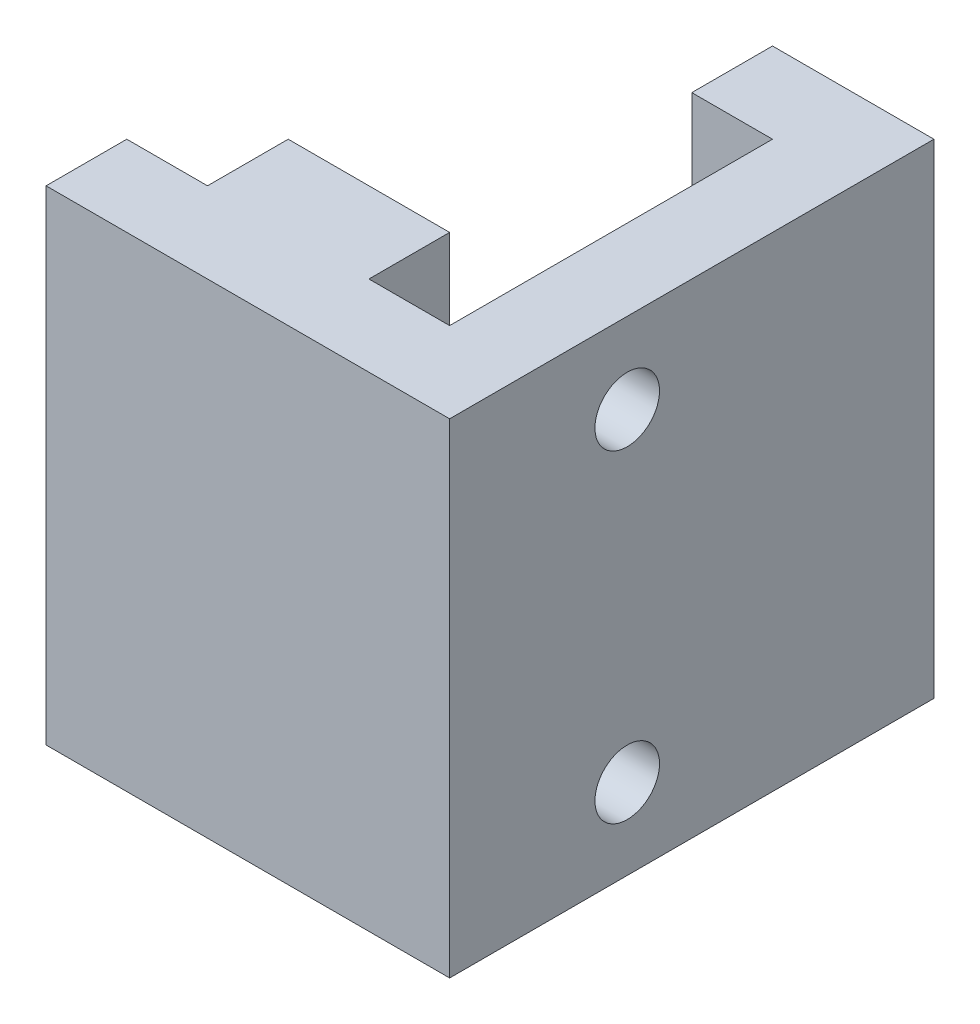
ISO-10303-21;
HEADER;
FILE_DESCRIPTION(('STEP AP214'),'2;1');
FILE_NAME('part.step','',(''),(''),'','','');
FILE_SCHEMA(('AUTOMOTIVE_DESIGN { 1 0 10303 214 1 1 1 1 }'));
ENDSEC;
DATA;
#1=APPLICATION_CONTEXT('core data for automotive mechanical design processes');
#2=APPLICATION_PROTOCOL_DEFINITION('international standard','automotive_design',2000,#1);
#3=PRODUCT_CONTEXT('',#1,'mechanical');
#4=PRODUCT('Part','Part','',(#3));
#5=PRODUCT_RELATED_PRODUCT_CATEGORY('part','',(#4));
#6=PRODUCT_DEFINITION_FORMATION('','',#4);
#7=PRODUCT_DEFINITION_CONTEXT('part definition',#1,'design');
#8=PRODUCT_DEFINITION('design','',#6,#7);
#9=PRODUCT_DEFINITION_SHAPE('','',#8);
#10=(LENGTH_UNIT() NAMED_UNIT(*) SI_UNIT(.MILLI.,.METRE.));
#11=(NAMED_UNIT(*) PLANE_ANGLE_UNIT() SI_UNIT($,.RADIAN.));
#12=(NAMED_UNIT(*) SI_UNIT($,.STERADIAN.) SOLID_ANGLE_UNIT());
#13=UNCERTAINTY_MEASURE_WITH_UNIT(LENGTH_MEASURE(1.E-05),#10,'distance_accuracy_value','');
#14=(GEOMETRIC_REPRESENTATION_CONTEXT(3) GLOBAL_UNCERTAINTY_ASSIGNED_CONTEXT((#13)) GLOBAL_UNIT_ASSIGNED_CONTEXT((#10,
#11,#12)) REPRESENTATION_CONTEXT('',''));
#15=CARTESIAN_POINT('',(0.,0.,0.));
#16=DIRECTION('',(0.,0.,1.));
#17=DIRECTION('',(1.,0.,0.));
#18=AXIS2_PLACEMENT_3D('',#15,#16,#17);
#19=CARTESIAN_POINT('',(5.,30.,-5.));
#20=DIRECTION('',(0.,0.,1.));
#21=DIRECTION('',(1.,0.,0.));
#22=AXIS2_PLACEMENT_3D('',#19,#20,#21);
#23=PLANE('',#22);
#24=DIRECTION('',(-1.,0.,0.));
#25=VECTOR('',#24,1.);
#26=CARTESIAN_POINT('',(5.,0.,-5.));
#27=LINE('',#26,#25);
#28=CARTESIAN_POINT('',(5.,0.,-5.));
#29=VERTEX_POINT('',#28);
#30=CARTESIAN_POINT('',(0.,0.,-5.));
#31=VERTEX_POINT('',#30);
#32=EDGE_CURVE('E159',#29,#31,#27,.T.);
#33=ORIENTED_EDGE('',*,*,#32,.T.);
#34=DIRECTION('',(0.,-1.,0.));
#35=VECTOR('',#34,1.);
#36=CARTESIAN_POINT('',(0.,30.,-5.));
#37=LINE('',#36,#35);
#38=CARTESIAN_POINT('',(0.,30.,-5.));
#39=VERTEX_POINT('',#38);
#40=EDGE_CURVE('E11',#39,#31,#37,.T.);
#41=ORIENTED_EDGE('',*,*,#40,.F.);
#42=DIRECTION('',(-1.,0.,0.));
#43=VECTOR('',#42,1.);
#44=CARTESIAN_POINT('',(5.,30.,-5.));
#45=LINE('',#44,#43);
#46=CARTESIAN_POINT('',(5.,30.,-5.));
#47=VERTEX_POINT('',#46);
#48=EDGE_CURVE('E182',#47,#39,#45,.T.);
#49=ORIENTED_EDGE('',*,*,#48,.F.);
#50=DIRECTION('',(0.,-1.,0.));
#51=VECTOR('',#50,1.);
#52=CARTESIAN_POINT('',(5.,30.,-5.));
#53=LINE('',#52,#51);
#54=EDGE_CURVE('E155',#47,#29,#53,.T.);
#55=ORIENTED_EDGE('',*,*,#54,.T.);
#56=EDGE_LOOP('',(#33,#41,#49,#55));
#57=FACE_BOUND('',#56,.T.);
#58=ADVANCED_FACE('F39',(#57),#23,.F.);
#59=CARTESIAN_POINT('',(0.,30.,-5.));
#60=DIRECTION('',(1.,0.,0.));
#61=DIRECTION('',(0.,0.,-1.));
#62=AXIS2_PLACEMENT_3D('',#59,#60,#61);
#63=PLANE('',#62);
#64=DIRECTION('',(0.,0.,1.));
#65=VECTOR('',#64,1.);
#66=CARTESIAN_POINT('',(0.,0.,-5.));
#67=LINE('',#66,#65);
#68=CARTESIAN_POINT('',(0.,0.,0.));
#69=VERTEX_POINT('',#68);
#70=EDGE_CURVE('E162',#31,#69,#67,.T.);
#71=ORIENTED_EDGE('',*,*,#70,.T.);
#72=DIRECTION('',(0.,-1.,0.));
#73=VECTOR('',#72,1.);
#74=CARTESIAN_POINT('',(0.,30.,0.));
#75=LINE('',#74,#73);
#76=CARTESIAN_POINT('',(0.,30.,0.));
#77=VERTEX_POINT('',#76);
#78=EDGE_CURVE('E47',#77,#69,#75,.T.);
#79=ORIENTED_EDGE('',*,*,#78,.F.);
#80=DIRECTION('',(0.,0.,1.));
#81=VECTOR('',#80,1.);
#82=CARTESIAN_POINT('',(0.,30.,-5.));
#83=LINE('',#82,#81);
#84=EDGE_CURVE('E110',#39,#77,#83,.T.);
#85=ORIENTED_EDGE('',*,*,#84,.F.);
#86=ORIENTED_EDGE('',*,*,#40,.T.);
#87=EDGE_LOOP('',(#71,#79,#85,#86));
#88=FACE_BOUND('',#87,.T.);
#89=ADVANCED_FACE('F260',(#88),#63,.F.);
#90=CARTESIAN_POINT('',(0.,30.,0.));
#91=DIRECTION('',(0.,0.,-1.));
#92=DIRECTION('',(-1.,0.,0.));
#93=AXIS2_PLACEMENT_3D('',#90,#91,#92);
#94=PLANE('',#93);
#95=DIRECTION('',(1.,0.,0.));
#96=VECTOR('',#95,1.);
#97=CARTESIAN_POINT('',(0.,0.,0.));
#98=LINE('',#97,#96);
#99=CARTESIAN_POINT('',(25.,0.,0.));
#100=VERTEX_POINT('',#99);
#101=EDGE_CURVE('E165',#69,#100,#98,.T.);
#102=ORIENTED_EDGE('',*,*,#101,.T.);
#103=DIRECTION('',(0.,-1.,0.));
#104=VECTOR('',#103,1.);
#105=CARTESIAN_POINT('',(25.,30.,0.));
#106=LINE('',#105,#104);
#107=CARTESIAN_POINT('',(25.,30.,0.));
#108=VERTEX_POINT('',#107);
#109=EDGE_CURVE('E201',#108,#100,#106,.T.);
#110=ORIENTED_EDGE('',*,*,#109,.F.);
#111=DIRECTION('',(1.,0.,0.));
#112=VECTOR('',#111,1.);
#113=CARTESIAN_POINT('',(0.,30.,0.));
#114=LINE('',#113,#112);
#115=EDGE_CURVE('E209',#77,#108,#114,.T.);
#116=ORIENTED_EDGE('',*,*,#115,.F.);
#117=ORIENTED_EDGE('',*,*,#78,.T.);
#118=EDGE_LOOP('',(#102,#110,#116,#117));
#119=FACE_BOUND('',#118,.T.);
#120=ADVANCED_FACE('F207',(#119),#94,.F.);
#121=CARTESIAN_POINT('',(25.,30.,0.));
#122=DIRECTION('',(-1.,0.,0.));
#123=DIRECTION('',(0.,0.,1.));
#124=AXIS2_PLACEMENT_3D('',#121,#122,#123);
#125=PLANE('',#124);
#126=CARTESIAN_POINT('',(25.,25.,-11.));
#127=DIRECTION('',(1.,0.,0.));
#128=DIRECTION('',(0.,0.,-1.));
#129=AXIS2_PLACEMENT_3D('',#126,#127,#128);
#130=CIRCLE('',#129,2.);
#131=CARTESIAN_POINT('',(25.,25.,-13.));
#132=VERTEX_POINT('',#131);
#133=EDGE_CURVE('E359',#132,#132,#130,.T.);
#134=ORIENTED_EDGE('',*,*,#133,.F.);
#135=EDGE_LOOP('',(#134));
#136=FACE_BOUND('',#135,.T.);
#137=CARTESIAN_POINT('',(25.,5.,-11.));
#138=DIRECTION('',(1.,0.,0.));
#139=DIRECTION('',(0.,0.,-1.));
#140=AXIS2_PLACEMENT_3D('',#137,#138,#139);
#141=CIRCLE('',#140,2.);
#142=CARTESIAN_POINT('',(25.,5.,-13.));
#143=VERTEX_POINT('',#142);
#144=EDGE_CURVE('E362',#143,#143,#141,.T.);
#145=ORIENTED_EDGE('',*,*,#144,.F.);
#146=EDGE_LOOP('',(#145));
#147=FACE_BOUND('',#146,.T.);
#148=DIRECTION('',(0.,0.,-1.));
#149=VECTOR('',#148,1.);
#150=CARTESIAN_POINT('',(25.,0.,0.));
#151=LINE('',#150,#149);
#152=CARTESIAN_POINT('',(25.,0.,-30.));
#153=VERTEX_POINT('',#152);
#154=EDGE_CURVE('E167',#100,#153,#151,.T.);
#155=ORIENTED_EDGE('',*,*,#154,.T.);
#156=DIRECTION('',(0.,-1.,0.));
#157=VECTOR('',#156,1.);
#158=CARTESIAN_POINT('',(25.,30.,-30.));
#159=LINE('',#158,#157);
#160=CARTESIAN_POINT('',(25.,30.,-30.));
#161=VERTEX_POINT('',#160);
#162=EDGE_CURVE('E198',#161,#153,#159,.T.);
#163=ORIENTED_EDGE('',*,*,#162,.F.);
#164=DIRECTION('',(0.,0.,-1.));
#165=VECTOR('',#164,1.);
#166=CARTESIAN_POINT('',(25.,30.,0.));
#167=LINE('',#166,#165);
#168=EDGE_CURVE('E227',#108,#161,#167,.T.);
#169=ORIENTED_EDGE('',*,*,#168,.F.);
#170=ORIENTED_EDGE('',*,*,#109,.T.);
#171=EDGE_LOOP('',(#155,#163,#169,#170));
#172=FACE_BOUND('',#171,.T.);
#173=ADVANCED_FACE('F218',(#136,#147,#172),#125,.F.);
#174=CARTESIAN_POINT('',(25.,30.,-30.));
#175=DIRECTION('',(0.,0.,1.));
#176=DIRECTION('',(1.,0.,0.));
#177=AXIS2_PLACEMENT_3D('',#174,#175,#176);
#178=PLANE('',#177);
#179=DIRECTION('',(-1.,0.,0.));
#180=VECTOR('',#179,1.);
#181=CARTESIAN_POINT('',(25.,0.,-30.));
#182=LINE('',#181,#180);
#183=CARTESIAN_POINT('',(15.,0.,-30.));
#184=VERTEX_POINT('',#183);
#185=EDGE_CURVE('E169',#153,#184,#182,.T.);
#186=ORIENTED_EDGE('',*,*,#185,.T.);
#187=DIRECTION('',(0.,-1.,0.));
#188=VECTOR('',#187,1.);
#189=CARTESIAN_POINT('',(15.,30.,-30.));
#190=LINE('',#189,#188);
#191=CARTESIAN_POINT('',(15.,30.,-30.));
#192=VERTEX_POINT('',#191);
#193=EDGE_CURVE('E195',#192,#184,#190,.T.);
#194=ORIENTED_EDGE('',*,*,#193,.F.);
#195=DIRECTION('',(-1.,0.,0.));
#196=VECTOR('',#195,1.);
#197=CARTESIAN_POINT('',(25.,30.,-30.));
#198=LINE('',#197,#196);
#199=EDGE_CURVE('E224',#161,#192,#198,.T.);
#200=ORIENTED_EDGE('',*,*,#199,.F.);
#201=ORIENTED_EDGE('',*,*,#162,.T.);
#202=EDGE_LOOP('',(#186,#194,#200,#201));
#203=FACE_BOUND('',#202,.T.);
#204=ADVANCED_FACE('F222',(#203),#178,.F.);
#205=CARTESIAN_POINT('',(15.,30.,-30.));
#206=DIRECTION('',(1.,0.,0.));
#207=DIRECTION('',(0.,0.,-1.));
#208=AXIS2_PLACEMENT_3D('',#205,#206,#207);
#209=PLANE('',#208);
#210=DIRECTION('',(0.,0.,1.));
#211=VECTOR('',#210,1.);
#212=CARTESIAN_POINT('',(15.,0.,-30.));
#213=LINE('',#212,#211);
#214=CARTESIAN_POINT('',(15.,0.,-25.));
#215=VERTEX_POINT('',#214);
#216=EDGE_CURVE('E171',#184,#215,#213,.T.);
#217=ORIENTED_EDGE('',*,*,#216,.T.);
#218=DIRECTION('',(0.,-1.,0.));
#219=VECTOR('',#218,1.);
#220=CARTESIAN_POINT('',(15.,30.,-25.));
#221=LINE('',#220,#219);
#222=CARTESIAN_POINT('',(15.,30.,-25.));
#223=VERTEX_POINT('',#222);
#224=EDGE_CURVE('E192',#223,#215,#221,.T.);
#225=ORIENTED_EDGE('',*,*,#224,.F.);
#226=DIRECTION('',(0.,0.,1.));
#227=VECTOR('',#226,1.);
#228=CARTESIAN_POINT('',(15.,30.,-30.));
#229=LINE('',#228,#227);
#230=EDGE_CURVE('E226',#192,#223,#229,.T.);
#231=ORIENTED_EDGE('',*,*,#230,.F.);
#232=ORIENTED_EDGE('',*,*,#193,.T.);
#233=EDGE_LOOP('',(#217,#225,#231,#232));
#234=FACE_BOUND('',#233,.T.);
#235=ADVANCED_FACE('F274',(#234),#209,.F.);
#236=CARTESIAN_POINT('',(15.,30.,-25.));
#237=DIRECTION('',(0.,0.,-1.));
#238=DIRECTION('',(-1.,0.,0.));
#239=AXIS2_PLACEMENT_3D('',#236,#237,#238);
#240=PLANE('',#239);
#241=DIRECTION('',(1.,0.,0.));
#242=VECTOR('',#241,1.);
#243=CARTESIAN_POINT('',(15.,0.,-25.));
#244=LINE('',#243,#242);
#245=CARTESIAN_POINT('',(20.,0.,-25.));
#246=VERTEX_POINT('',#245);
#247=EDGE_CURVE('E173',#215,#246,#244,.T.);
#248=ORIENTED_EDGE('',*,*,#247,.T.);
#249=DIRECTION('',(0.,-1.,0.));
#250=VECTOR('',#249,1.);
#251=CARTESIAN_POINT('',(20.,30.,-25.));
#252=LINE('',#251,#250);
#253=CARTESIAN_POINT('',(20.,30.,-25.));
#254=VERTEX_POINT('',#253);
#255=EDGE_CURVE('E189',#254,#246,#252,.T.);
#256=ORIENTED_EDGE('',*,*,#255,.F.);
#257=DIRECTION('',(1.,0.,0.));
#258=VECTOR('',#257,1.);
#259=CARTESIAN_POINT('',(15.,30.,-25.));
#260=LINE('',#259,#258);
#261=EDGE_CURVE('E229',#223,#254,#260,.T.);
#262=ORIENTED_EDGE('',*,*,#261,.F.);
#263=ORIENTED_EDGE('',*,*,#224,.T.);
#264=EDGE_LOOP('',(#248,#256,#262,#263));
#265=FACE_BOUND('',#264,.T.);
#266=ADVANCED_FACE('F277',(#265),#240,.F.);
#267=CARTESIAN_POINT('',(20.,30.,-25.));
#268=DIRECTION('',(1.,0.,0.));
#269=DIRECTION('',(0.,0.,-1.));
#270=AXIS2_PLACEMENT_3D('',#267,#268,#269);
#271=PLANE('',#270);
#272=DIRECTION('',(0.,0.,1.));
#273=VECTOR('',#272,1.);
#274=CARTESIAN_POINT('',(20.,0.,-25.));
#275=LINE('',#274,#273);
#276=CARTESIAN_POINT('',(20.,0.,-5.));
#277=VERTEX_POINT('',#276);
#278=EDGE_CURVE('E175',#246,#277,#275,.T.);
#279=ORIENTED_EDGE('',*,*,#278,.T.);
#280=DIRECTION('',(0.,-1.,0.));
#281=VECTOR('',#280,1.);
#282=CARTESIAN_POINT('',(20.,30.,-5.));
#283=LINE('',#282,#281);
#284=CARTESIAN_POINT('',(20.,30.,-5.));
#285=VERTEX_POINT('',#284);
#286=EDGE_CURVE('E186',#285,#277,#283,.T.);
#287=ORIENTED_EDGE('',*,*,#286,.F.);
#288=DIRECTION('',(0.,0.,1.));
#289=VECTOR('',#288,1.);
#290=CARTESIAN_POINT('',(20.,30.,-25.));
#291=LINE('',#290,#289);
#292=EDGE_CURVE('E235',#254,#285,#291,.T.);
#293=ORIENTED_EDGE('',*,*,#292,.F.);
#294=ORIENTED_EDGE('',*,*,#255,.T.);
#295=EDGE_LOOP('',(#279,#287,#293,#294));
#296=FACE_BOUND('',#295,.T.);
#297=ADVANCED_FACE('F241',(#296),#271,.F.);
#298=CARTESIAN_POINT('',(20.,30.,-5.));
#299=DIRECTION('',(0.,0.,1.));
#300=DIRECTION('',(1.,0.,0.));
#301=AXIS2_PLACEMENT_3D('',#298,#299,#300);
#302=PLANE('',#301);
#303=DIRECTION('',(-1.,0.,0.));
#304=VECTOR('',#303,1.);
#305=CARTESIAN_POINT('',(20.,0.,-5.));
#306=LINE('',#305,#304);
#307=CARTESIAN_POINT('',(15.,0.,-5.));
#308=VERTEX_POINT('',#307);
#309=EDGE_CURVE('E177',#277,#308,#306,.T.);
#310=ORIENTED_EDGE('',*,*,#309,.T.);
#311=DIRECTION('',(0.,-1.,0.));
#312=VECTOR('',#311,1.);
#313=CARTESIAN_POINT('',(15.,30.,-5.));
#314=LINE('',#313,#312);
#315=CARTESIAN_POINT('',(15.,30.,-5.));
#316=VERTEX_POINT('',#315);
#317=EDGE_CURVE('E150',#316,#308,#314,.T.);
#318=ORIENTED_EDGE('',*,*,#317,.F.);
#319=DIRECTION('',(-1.,0.,0.));
#320=VECTOR('',#319,1.);
#321=CARTESIAN_POINT('',(20.,30.,-5.));
#322=LINE('',#321,#320);
#323=EDGE_CURVE('E141',#285,#316,#322,.T.);
#324=ORIENTED_EDGE('',*,*,#323,.F.);
#325=ORIENTED_EDGE('',*,*,#286,.T.);
#326=EDGE_LOOP('',(#310,#318,#324,#325));
#327=FACE_BOUND('',#326,.T.);
#328=ADVANCED_FACE('F245',(#327),#302,.F.);
#329=CARTESIAN_POINT('',(15.,30.,-5.));
#330=DIRECTION('',(-1.,0.,0.));
#331=DIRECTION('',(0.,0.,1.));
#332=AXIS2_PLACEMENT_3D('',#329,#330,#331);
#333=PLANE('',#332);
#334=DIRECTION('',(0.,0.,-1.));
#335=VECTOR('',#334,1.);
#336=CARTESIAN_POINT('',(15.,0.,-5.));
#337=LINE('',#336,#335);
#338=CARTESIAN_POINT('',(15.,0.,-10.));
#339=VERTEX_POINT('',#338);
#340=EDGE_CURVE('E149',#308,#339,#337,.T.);
#341=ORIENTED_EDGE('',*,*,#340,.T.);
#342=DIRECTION('',(0.,-1.,0.));
#343=VECTOR('',#342,1.);
#344=CARTESIAN_POINT('',(15.,30.,-10.));
#345=LINE('',#344,#343);
#346=CARTESIAN_POINT('',(15.,30.,-10.));
#347=VERTEX_POINT('',#346);
#348=EDGE_CURVE('E146',#347,#339,#345,.T.);
#349=ORIENTED_EDGE('',*,*,#348,.F.);
#350=DIRECTION('',(0.,0.,-1.));
#351=VECTOR('',#350,1.);
#352=CARTESIAN_POINT('',(15.,30.,-5.));
#353=LINE('',#352,#351);
#354=EDGE_CURVE('E135',#316,#347,#353,.T.);
#355=ORIENTED_EDGE('',*,*,#354,.F.);
#356=ORIENTED_EDGE('',*,*,#317,.T.);
#357=EDGE_LOOP('',(#341,#349,#355,#356));
#358=FACE_BOUND('',#357,.T.);
#359=ADVANCED_FACE('F147',(#358),#333,.F.);
#360=CARTESIAN_POINT('',(15.,30.,-10.));
#361=DIRECTION('',(0.,0.,1.));
#362=DIRECTION('',(1.,0.,0.));
#363=AXIS2_PLACEMENT_3D('',#360,#361,#362);
#364=PLANE('',#363);
#365=DIRECTION('',(-1.,0.,0.));
#366=VECTOR('',#365,1.);
#367=CARTESIAN_POINT('',(15.,0.,-10.));
#368=LINE('',#367,#366);
#369=CARTESIAN_POINT('',(5.,0.,-10.));
#370=VERTEX_POINT('',#369);
#371=EDGE_CURVE('E96',#339,#370,#368,.T.);
#372=ORIENTED_EDGE('',*,*,#371,.T.);
#373=DIRECTION('',(0.,-1.,0.));
#374=VECTOR('',#373,1.);
#375=CARTESIAN_POINT('',(5.,30.,-10.));
#376=LINE('',#375,#374);
#377=CARTESIAN_POINT('',(5.,30.,-10.));
#378=VERTEX_POINT('',#377);
#379=EDGE_CURVE('E151',#378,#370,#376,.T.);
#380=ORIENTED_EDGE('',*,*,#379,.F.);
#381=DIRECTION('',(-1.,0.,0.));
#382=VECTOR('',#381,1.);
#383=CARTESIAN_POINT('',(15.,30.,-10.));
#384=LINE('',#383,#382);
#385=EDGE_CURVE('E139',#347,#378,#384,.T.);
#386=ORIENTED_EDGE('',*,*,#385,.F.);
#387=ORIENTED_EDGE('',*,*,#348,.T.);
#388=EDGE_LOOP('',(#372,#380,#386,#387));
#389=FACE_BOUND('',#388,.T.);
#390=ADVANCED_FACE('F153',(#389),#364,.F.);
#391=CARTESIAN_POINT('',(5.,30.,-10.));
#392=DIRECTION('',(1.,0.,0.));
#393=DIRECTION('',(0.,0.,-1.));
#394=AXIS2_PLACEMENT_3D('',#391,#392,#393);
#395=PLANE('',#394);
#396=DIRECTION('',(0.,0.,1.));
#397=VECTOR('',#396,1.);
#398=CARTESIAN_POINT('',(5.,0.,-10.));
#399=LINE('',#398,#397);
#400=EDGE_CURVE('E102',#370,#29,#399,.T.);
#401=ORIENTED_EDGE('',*,*,#400,.T.);
#402=ORIENTED_EDGE('',*,*,#54,.F.);
#403=DIRECTION('',(0.,0.,1.));
#404=VECTOR('',#403,1.);
#405=CARTESIAN_POINT('',(5.,30.,-10.));
#406=LINE('',#405,#404);
#407=EDGE_CURVE('E55',#378,#47,#406,.T.);
#408=ORIENTED_EDGE('',*,*,#407,.F.);
#409=ORIENTED_EDGE('',*,*,#379,.T.);
#410=EDGE_LOOP('',(#401,#402,#408,#409));
#411=FACE_BOUND('',#410,.T.);
#412=ADVANCED_FACE('F249',(#411),#395,.F.);
#413=CARTESIAN_POINT('',(0.,30.,0.));
#414=DIRECTION('',(0.,1.,0.));
#415=DIRECTION('',(0.,0.,1.));
#416=AXIS2_PLACEMENT_3D('',#413,#414,#415);
#417=PLANE('',#416);
#418=ORIENTED_EDGE('',*,*,#48,.T.);
#419=ORIENTED_EDGE('',*,*,#84,.T.);
#420=ORIENTED_EDGE('',*,*,#115,.T.);
#421=ORIENTED_EDGE('',*,*,#168,.T.);
#422=ORIENTED_EDGE('',*,*,#199,.T.);
#423=ORIENTED_EDGE('',*,*,#230,.T.);
#424=ORIENTED_EDGE('',*,*,#261,.T.);
#425=ORIENTED_EDGE('',*,*,#292,.T.);
#426=ORIENTED_EDGE('',*,*,#323,.T.);
#427=ORIENTED_EDGE('',*,*,#354,.T.);
#428=ORIENTED_EDGE('',*,*,#385,.T.);
#429=ORIENTED_EDGE('',*,*,#407,.T.);
#430=EDGE_LOOP('',(#418,#419,#420,#421,#422,#423,#424,#425,#426,#427,#428,#429));
#431=FACE_BOUND('',#430,.T.);
#432=ADVANCED_FACE('F137',(#431),#417,.T.);
#433=CARTESIAN_POINT('',(0.,0.,0.));
#434=DIRECTION('',(0.,1.,0.));
#435=DIRECTION('',(0.,0.,1.));
#436=AXIS2_PLACEMENT_3D('',#433,#434,#435);
#437=PLANE('',#436);
#438=ORIENTED_EDGE('',*,*,#32,.F.);
#439=ORIENTED_EDGE('',*,*,#400,.F.);
#440=ORIENTED_EDGE('',*,*,#371,.F.);
#441=ORIENTED_EDGE('',*,*,#340,.F.);
#442=ORIENTED_EDGE('',*,*,#309,.F.);
#443=ORIENTED_EDGE('',*,*,#278,.F.);
#444=ORIENTED_EDGE('',*,*,#247,.F.);
#445=ORIENTED_EDGE('',*,*,#216,.F.);
#446=ORIENTED_EDGE('',*,*,#185,.F.);
#447=ORIENTED_EDGE('',*,*,#154,.F.);
#448=ORIENTED_EDGE('',*,*,#101,.F.);
#449=ORIENTED_EDGE('',*,*,#70,.F.);
#450=EDGE_LOOP('',(#438,#439,#440,#441,#442,#443,#444,#445,#446,#447,#448,#449));
#451=FACE_BOUND('',#450,.T.);
#452=ADVANCED_FACE('F213',(#451),#437,.F.);
#453=CARTESIAN_POINT('',(22.,5.,-11.));
#454=DIRECTION('',(1.,0.,0.));
#455=DIRECTION('',(0.,0.,-1.));
#456=AXIS2_PLACEMENT_3D('',#453,#454,#455);
#457=CYLINDRICAL_SURFACE('',#456,2.);
#458=CARTESIAN_POINT('',(22.,5.,-11.));
#459=DIRECTION('',(1.,0.,0.));
#460=DIRECTION('',(0.,0.,-1.));
#461=AXIS2_PLACEMENT_3D('',#458,#459,#460);
#462=CIRCLE('',#461,2.);
#463=CARTESIAN_POINT('',(22.,5.,-13.));
#464=VERTEX_POINT('',#463);
#465=EDGE_CURVE('E367',#464,#464,#462,.T.);
#466=ORIENTED_EDGE('',*,*,#465,.F.);
#467=EDGE_LOOP('',(#466));
#468=FACE_BOUND('',#467,.T.);
#469=ORIENTED_EDGE('',*,*,#144,.T.);
#470=EDGE_LOOP('',(#469));
#471=FACE_BOUND('',#470,.T.);
#472=ADVANCED_FACE('F316',(#468,#471),#457,.F.);
#473=CARTESIAN_POINT('',(22.,5.,-11.));
#474=DIRECTION('',(1.,0.,0.));
#475=DIRECTION('',(0.,0.,-1.));
#476=AXIS2_PLACEMENT_3D('',#473,#474,#475);
#477=PLANE('',#476);
#478=ORIENTED_EDGE('',*,*,#465,.T.);
#479=EDGE_LOOP('',(#478));
#480=FACE_BOUND('',#479,.T.);
#481=ADVANCED_FACE('F324',(#480),#477,.T.);
#482=CARTESIAN_POINT('',(22.,25.,-11.));
#483=DIRECTION('',(1.,0.,0.));
#484=DIRECTION('',(0.,0.,-1.));
#485=AXIS2_PLACEMENT_3D('',#482,#483,#484);
#486=CYLINDRICAL_SURFACE('',#485,2.);
#487=CARTESIAN_POINT('',(22.,25.,-11.));
#488=DIRECTION('',(1.,0.,0.));
#489=DIRECTION('',(0.,0.,-1.));
#490=AXIS2_PLACEMENT_3D('',#487,#488,#489);
#491=CIRCLE('',#490,2.);
#492=CARTESIAN_POINT('',(22.,25.,-13.));
#493=VERTEX_POINT('',#492);
#494=EDGE_CURVE('E163',#493,#493,#491,.T.);
#495=ORIENTED_EDGE('',*,*,#494,.F.);
#496=EDGE_LOOP('',(#495));
#497=FACE_BOUND('',#496,.T.);
#498=ORIENTED_EDGE('',*,*,#133,.T.);
#499=EDGE_LOOP('',(#498));
#500=FACE_BOUND('',#499,.T.);
#501=ADVANCED_FACE('F334',(#497,#500),#486,.F.);
#502=CARTESIAN_POINT('',(22.,25.,-11.));
#503=DIRECTION('',(1.,0.,0.));
#504=DIRECTION('',(0.,0.,-1.));
#505=AXIS2_PLACEMENT_3D('',#502,#503,#504);
#506=PLANE('',#505);
#507=ORIENTED_EDGE('',*,*,#494,.T.);
#508=EDGE_LOOP('',(#507));
#509=FACE_BOUND('',#508,.T.);
#510=ADVANCED_FACE('F344',(#509),#506,.T.);
#511=CLOSED_SHELL('',(#58,#89,#120,#173,#204,#235,#266,#297,#328,#359,#390,#412,#432,#452,#472,
#481,#501,#510));
#512=MANIFOLD_SOLID_BREP('B2',#511);
#513=ADVANCED_BREP_SHAPE_REPRESENTATION('',(#18,#512),#14);
#514=SHAPE_DEFINITION_REPRESENTATION(#9,#513);
ENDSEC;
END-ISO-10303-21;
